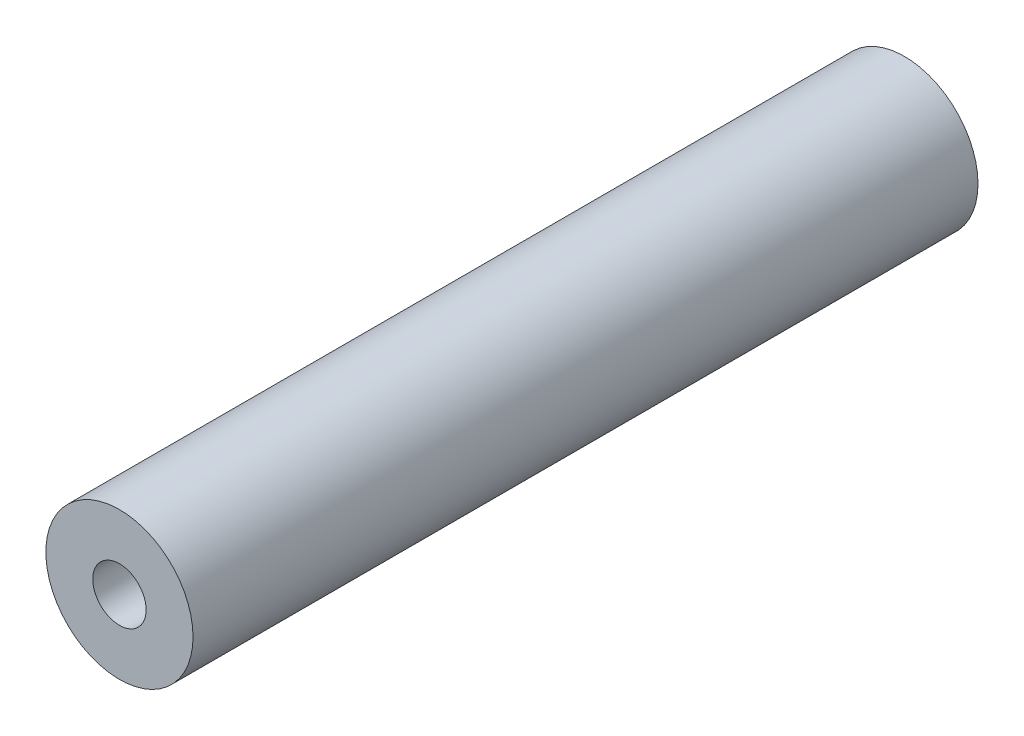
ISO-10303-21;
HEADER;
FILE_DESCRIPTION(('STEP AP214'),'2;1');
FILE_NAME('part.step','',(''),(''),'','','');
FILE_SCHEMA(('AUTOMOTIVE_DESIGN { 1 0 10303 214 1 1 1 1 }'));
ENDSEC;
DATA;
#1=APPLICATION_CONTEXT('core data for automotive mechanical design processes');
#2=APPLICATION_PROTOCOL_DEFINITION('international standard','automotive_design',2000,#1);
#3=PRODUCT_CONTEXT('',#1,'mechanical');
#4=PRODUCT('Part','Part','',(#3));
#5=PRODUCT_RELATED_PRODUCT_CATEGORY('part','',(#4));
#6=PRODUCT_DEFINITION_FORMATION('','',#4);
#7=PRODUCT_DEFINITION_CONTEXT('part definition',#1,'design');
#8=PRODUCT_DEFINITION('design','',#6,#7);
#9=PRODUCT_DEFINITION_SHAPE('','',#8);
#10=(LENGTH_UNIT() NAMED_UNIT(*) SI_UNIT(.MILLI.,.METRE.));
#11=(NAMED_UNIT(*) PLANE_ANGLE_UNIT() SI_UNIT($,.RADIAN.));
#12=(NAMED_UNIT(*) SI_UNIT($,.STERADIAN.) SOLID_ANGLE_UNIT());
#13=UNCERTAINTY_MEASURE_WITH_UNIT(LENGTH_MEASURE(1.E-05),#10,'distance_accuracy_value','');
#14=(GEOMETRIC_REPRESENTATION_CONTEXT(3) GLOBAL_UNCERTAINTY_ASSIGNED_CONTEXT((#13)) GLOBAL_UNIT_ASSIGNED_CONTEXT((#10,
#11,#12)) REPRESENTATION_CONTEXT('',''));
#15=CARTESIAN_POINT('',(0.,0.,0.));
#16=DIRECTION('',(0.,0.,1.));
#17=DIRECTION('',(1.,0.,0.));
#18=AXIS2_PLACEMENT_3D('',#15,#16,#17);
#19=CARTESIAN_POINT('',(0.,0.,25.4));
#20=DIRECTION('',(0.,0.,-1.));
#21=DIRECTION('',(-1.,0.,0.));
#22=AXIS2_PLACEMENT_3D('',#19,#20,#21);
#23=CYLINDRICAL_SURFACE('',#22,4.7625);
#24=CARTESIAN_POINT('',(0.,0.,25.4));
#25=DIRECTION('',(0.,0.,1.));
#26=DIRECTION('',(1.,0.,0.));
#27=AXIS2_PLACEMENT_3D('',#24,#25,#26);
#28=CIRCLE('',#27,4.7625);
#29=CARTESIAN_POINT('',(4.7625,0.,25.4));
#30=VERTEX_POINT('',#29);
#31=EDGE_CURVE('E11',#30,#30,#28,.T.);
#32=ORIENTED_EDGE('',*,*,#31,.F.);
#33=EDGE_LOOP('',(#32));
#34=FACE_BOUND('',#33,.T.);
#35=CARTESIAN_POINT('',(0.,0.,-25.4));
#36=DIRECTION('',(0.,0.,1.));
#37=DIRECTION('',(1.,0.,0.));
#38=AXIS2_PLACEMENT_3D('',#35,#36,#37);
#39=CIRCLE('',#38,4.7625);
#40=CARTESIAN_POINT('',(4.7625,0.,-25.4));
#41=VERTEX_POINT('',#40);
#42=EDGE_CURVE('E38',#41,#41,#39,.T.);
#43=ORIENTED_EDGE('',*,*,#42,.T.);
#44=EDGE_LOOP('',(#43));
#45=FACE_BOUND('',#44,.T.);
#46=ADVANCED_FACE('F35',(#34,#45),#23,.T.);
#47=CARTESIAN_POINT('',(0.,0.,25.4));
#48=DIRECTION('',(0.,0.,1.));
#49=DIRECTION('',(1.,0.,0.));
#50=AXIS2_PLACEMENT_3D('',#47,#48,#49);
#51=PLANE('',#50);
#52=CARTESIAN_POINT('',(0.,0.,25.4));
#53=DIRECTION('',(0.,0.,1.));
#54=DIRECTION('',(1.,0.,0.));
#55=AXIS2_PLACEMENT_3D('',#52,#53,#54);
#56=CIRCLE('',#55,1.72719999999999);
#57=CARTESIAN_POINT('',(1.72719999999999,0.,25.4));
#58=VERTEX_POINT('',#57);
#59=EDGE_CURVE('E59',#58,#58,#56,.T.);
#60=ORIENTED_EDGE('',*,*,#59,.F.);
#61=EDGE_LOOP('',(#60));
#62=FACE_BOUND('',#61,.T.);
#63=ORIENTED_EDGE('',*,*,#31,.T.);
#64=EDGE_LOOP('',(#63));
#65=FACE_BOUND('',#64,.T.);
#66=ADVANCED_FACE('F77',(#62,#65),#51,.T.);
#67=CARTESIAN_POINT('',(0.,0.,-25.4));
#68=DIRECTION('',(0.,0.,1.));
#69=DIRECTION('',(1.,0.,0.));
#70=AXIS2_PLACEMENT_3D('',#67,#68,#69);
#71=PLANE('',#70);
#72=CARTESIAN_POINT('',(0.,0.,-25.4));
#73=DIRECTION('',(0.,0.,-1.));
#74=DIRECTION('',(-1.,0.,0.));
#75=AXIS2_PLACEMENT_3D('',#72,#73,#74);
#76=CIRCLE('',#75,1.72719999999999);
#77=CARTESIAN_POINT('',(-1.72719999999999,0.,-25.4));
#78=VERTEX_POINT('',#77);
#79=EDGE_CURVE('E58',#78,#78,#76,.T.);
#80=ORIENTED_EDGE('',*,*,#79,.F.);
#81=EDGE_LOOP('',(#80));
#82=FACE_BOUND('',#81,.T.);
#83=ORIENTED_EDGE('',*,*,#42,.F.);
#84=EDGE_LOOP('',(#83));
#85=FACE_BOUND('',#84,.T.);
#86=ADVANCED_FACE('F74',(#82,#85),#71,.F.);
#87=CARTESIAN_POINT('',(0.,0.,-19.05));
#88=DIRECTION('',(0.,0.,-1.));
#89=DIRECTION('',(-1.,0.,0.));
#90=AXIS2_PLACEMENT_3D('',#87,#88,#89);
#91=CONICAL_SURFACE('',#90,1.72719999999999,1.02974425867665);
#92=CARTESIAN_POINT('',(0.,0.,-18.0121935388156));
#93=VERTEX_POINT('',#92);
#94=VERTEX_LOOP('',#93);
#95=FACE_BOUND('',#94,.T.);
#96=CARTESIAN_POINT('',(0.,0.,-19.05));
#97=DIRECTION('',(0.,0.,-1.));
#98=DIRECTION('',(-1.,0.,0.));
#99=AXIS2_PLACEMENT_3D('',#96,#97,#98);
#100=CIRCLE('',#99,1.72719999999999);
#101=CARTESIAN_POINT('',(-1.72719999999999,0.,-19.05));
#102=VERTEX_POINT('',#101);
#103=EDGE_CURVE('E62',#102,#102,#100,.T.);
#104=ORIENTED_EDGE('',*,*,#103,.T.);
#105=EDGE_LOOP('',(#104));
#106=FACE_BOUND('',#105,.T.);
#107=ADVANCED_FACE('F76',(#95,#106),#91,.F.);
#108=CARTESIAN_POINT('',(0.,0.,-25.4));
#109=DIRECTION('',(0.,0.,-1.));
#110=DIRECTION('',(-1.,0.,0.));
#111=AXIS2_PLACEMENT_3D('',#108,#109,#110);
#112=CYLINDRICAL_SURFACE('',#111,1.72719999999999);
#113=ORIENTED_EDGE('',*,*,#103,.F.);
#114=EDGE_LOOP('',(#113));
#115=FACE_BOUND('',#114,.T.);
#116=ORIENTED_EDGE('',*,*,#79,.T.);
#117=EDGE_LOOP('',(#116));
#118=FACE_BOUND('',#117,.T.);
#119=ADVANCED_FACE('F52',(#115,#118),#112,.F.);
#120=CARTESIAN_POINT('',(0.,0.,19.05));
#121=DIRECTION('',(0.,0.,1.));
#122=DIRECTION('',(1.,0.,0.));
#123=AXIS2_PLACEMENT_3D('',#120,#121,#122);
#124=CONICAL_SURFACE('',#123,1.72719999999999,1.02974425867665);
#125=CARTESIAN_POINT('',(0.,0.,18.0121935388156));
#126=VERTEX_POINT('',#125);
#127=VERTEX_LOOP('',#126);
#128=FACE_BOUND('',#127,.T.);
#129=CARTESIAN_POINT('',(0.,0.,19.05));
#130=DIRECTION('',(0.,0.,1.));
#131=DIRECTION('',(1.,0.,0.));
#132=AXIS2_PLACEMENT_3D('',#129,#130,#131);
#133=CIRCLE('',#132,1.72719999999999);
#134=CARTESIAN_POINT('',(1.72719999999999,0.,19.05));
#135=VERTEX_POINT('',#134);
#136=EDGE_CURVE('E56',#135,#135,#133,.T.);
#137=ORIENTED_EDGE('',*,*,#136,.T.);
#138=EDGE_LOOP('',(#137));
#139=FACE_BOUND('',#138,.T.);
#140=ADVANCED_FACE('F48',(#128,#139),#124,.F.);
#141=CARTESIAN_POINT('',(0.,0.,25.4));
#142=DIRECTION('',(0.,0.,1.));
#143=DIRECTION('',(1.,0.,0.));
#144=AXIS2_PLACEMENT_3D('',#141,#142,#143);
#145=CYLINDRICAL_SURFACE('',#144,1.72719999999999);
#146=ORIENTED_EDGE('',*,*,#136,.F.);
#147=EDGE_LOOP('',(#146));
#148=FACE_BOUND('',#147,.T.);
#149=ORIENTED_EDGE('',*,*,#59,.T.);
#150=EDGE_LOOP('',(#149));
#151=FACE_BOUND('',#150,.T.);
#152=ADVANCED_FACE('F51',(#148,#151),#145,.F.);
#153=CLOSED_SHELL('',(#46,#66,#86,#107,#119,#140,#152));
#154=MANIFOLD_SOLID_BREP('B2',#153);
#155=ADVANCED_BREP_SHAPE_REPRESENTATION('',(#18,#154),#14);
#156=SHAPE_DEFINITION_REPRESENTATION(#9,#155);
ENDSEC;
END-ISO-10303-21;
